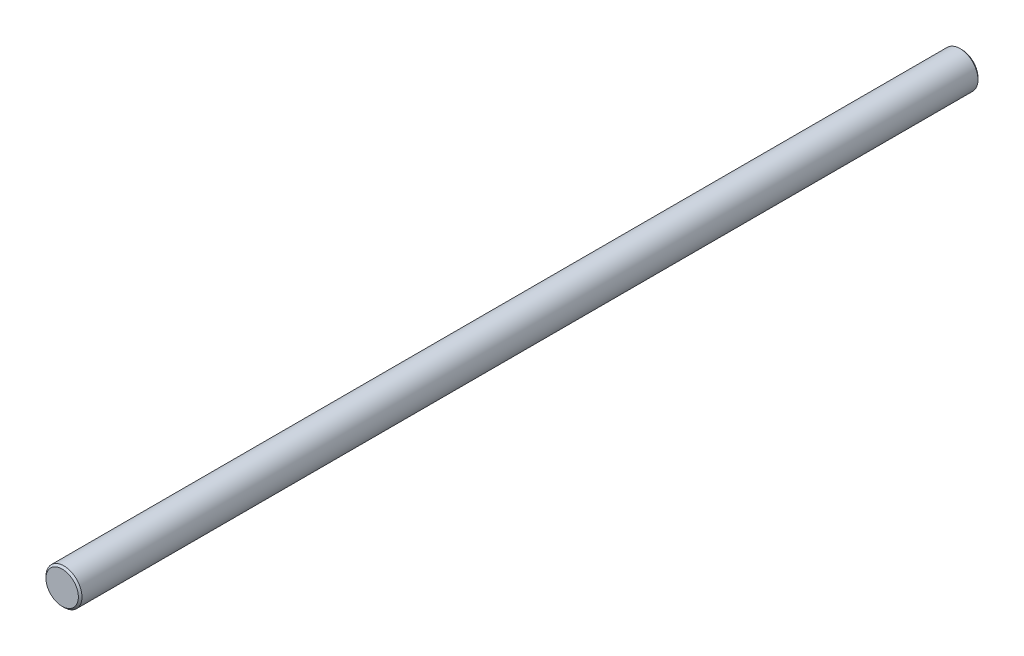
ISO-10303-21;
HEADER;
FILE_DESCRIPTION(('STEP AP214'),'2;1');
FILE_NAME('part.step','',(''),(''),'','','');
FILE_SCHEMA(('AUTOMOTIVE_DESIGN { 1 0 10303 214 1 1 1 1 }'));
ENDSEC;
DATA;
#1=APPLICATION_CONTEXT('core data for automotive mechanical design processes');
#2=APPLICATION_PROTOCOL_DEFINITION('international standard','automotive_design',2000,#1);
#3=PRODUCT_CONTEXT('',#1,'mechanical');
#4=PRODUCT('Part','Part','',(#3));
#5=PRODUCT_RELATED_PRODUCT_CATEGORY('part','',(#4));
#6=PRODUCT_DEFINITION_FORMATION('','',#4);
#7=PRODUCT_DEFINITION_CONTEXT('part definition',#1,'design');
#8=PRODUCT_DEFINITION('design','',#6,#7);
#9=PRODUCT_DEFINITION_SHAPE('','',#8);
#10=(LENGTH_UNIT() NAMED_UNIT(*) SI_UNIT(.MILLI.,.METRE.));
#11=(NAMED_UNIT(*) PLANE_ANGLE_UNIT() SI_UNIT($,.RADIAN.));
#12=(NAMED_UNIT(*) SI_UNIT($,.STERADIAN.) SOLID_ANGLE_UNIT());
#13=UNCERTAINTY_MEASURE_WITH_UNIT(LENGTH_MEASURE(1.E-05),#10,'distance_accuracy_value','');
#14=(GEOMETRIC_REPRESENTATION_CONTEXT(3) GLOBAL_UNCERTAINTY_ASSIGNED_CONTEXT((#13)) GLOBAL_UNIT_ASSIGNED_CONTEXT((#10,
#11,#12)) REPRESENTATION_CONTEXT('',''));
#15=CARTESIAN_POINT('',(0.,0.,0.));
#16=DIRECTION('',(0.,0.,1.));
#17=DIRECTION('',(1.,0.,0.));
#18=AXIS2_PLACEMENT_3D('',#15,#16,#17);
#19=CARTESIAN_POINT('',(0.,0.,500.));
#20=DIRECTION('',(0.,0.,-1.));
#21=DIRECTION('',(-1.,0.,0.));
#22=AXIS2_PLACEMENT_3D('',#19,#20,#21);
#23=CYLINDRICAL_SURFACE('',#22,10.);
#24=CARTESIAN_POINT('',(0.,0.,499.));
#25=DIRECTION('',(0.,0.,1.));
#26=DIRECTION('',(1.,0.,0.));
#27=AXIS2_PLACEMENT_3D('',#24,#25,#26);
#28=CIRCLE('',#27,10.);
#29=CARTESIAN_POINT('',(10.,0.,499.));
#30=VERTEX_POINT('',#29);
#31=EDGE_CURVE('E38',#30,#30,#28,.F.);
#32=ORIENTED_EDGE('',*,*,#31,.T.);
#33=EDGE_LOOP('',(#32));
#34=FACE_BOUND('',#33,.T.);
#35=CARTESIAN_POINT('',(0.,0.,1.));
#36=DIRECTION('',(0.,0.,1.));
#37=DIRECTION('',(1.,0.,0.));
#38=AXIS2_PLACEMENT_3D('',#35,#36,#37);
#39=CIRCLE('',#38,10.);
#40=CARTESIAN_POINT('',(10.,0.,1.));
#41=VERTEX_POINT('',#40);
#42=EDGE_CURVE('E42',#41,#41,#39,.T.);
#43=ORIENTED_EDGE('',*,*,#42,.T.);
#44=EDGE_LOOP('',(#43));
#45=FACE_BOUND('',#44,.T.);
#46=ADVANCED_FACE('F31',(#34,#45),#23,.T.);
#47=CARTESIAN_POINT('',(0.,0.,500.));
#48=DIRECTION('',(0.,0.,1.));
#49=DIRECTION('',(1.,0.,0.));
#50=AXIS2_PLACEMENT_3D('',#47,#48,#49);
#51=PLANE('',#50);
#52=CARTESIAN_POINT('',(0.,0.,500.));
#53=DIRECTION('',(0.,0.,1.));
#54=DIRECTION('',(1.,0.,0.));
#55=AXIS2_PLACEMENT_3D('',#52,#53,#54);
#56=CIRCLE('',#55,8.9999999999999);
#57=CARTESIAN_POINT('',(8.9999999999999,0.,500.));
#58=VERTEX_POINT('',#57);
#59=EDGE_CURVE('E46',#58,#58,#56,.T.);
#60=ORIENTED_EDGE('',*,*,#59,.T.);
#61=EDGE_LOOP('',(#60));
#62=FACE_BOUND('',#61,.T.);
#63=ADVANCED_FACE('F52',(#62),#51,.T.);
#64=CARTESIAN_POINT('',(0.,0.,0.));
#65=DIRECTION('',(0.,0.,1.));
#66=DIRECTION('',(1.,0.,0.));
#67=AXIS2_PLACEMENT_3D('',#64,#65,#66);
#68=PLANE('',#67);
#69=CARTESIAN_POINT('',(0.,0.,0.));
#70=DIRECTION('',(0.,0.,1.));
#71=DIRECTION('',(1.,0.,0.));
#72=AXIS2_PLACEMENT_3D('',#69,#70,#71);
#73=CIRCLE('',#72,9.00000000000001);
#74=CARTESIAN_POINT('',(9.00000000000001,0.,0.));
#75=VERTEX_POINT('',#74);
#76=EDGE_CURVE('E10',#75,#75,#73,.F.);
#77=ORIENTED_EDGE('',*,*,#76,.T.);
#78=EDGE_LOOP('',(#77));
#79=FACE_BOUND('',#78,.T.);
#80=ADVANCED_FACE('F56',(#79),#68,.F.);
#81=CARTESIAN_POINT('',(0.,0.,500.));
#82=DIRECTION('',(0.,0.,-1.));
#83=DIRECTION('',(-1.,0.,0.));
#84=AXIS2_PLACEMENT_3D('',#81,#82,#83);
#85=CONICAL_SURFACE('',#84,8.9999999999999,0.785398163397444);
#86=ORIENTED_EDGE('',*,*,#31,.F.);
#87=EDGE_LOOP('',(#86));
#88=FACE_BOUND('',#87,.T.);
#89=ORIENTED_EDGE('',*,*,#59,.F.);
#90=EDGE_LOOP('',(#89));
#91=FACE_BOUND('',#90,.T.);
#92=ADVANCED_FACE('F54',(#88,#91),#85,.T.);
#93=CARTESIAN_POINT('',(0.,0.,1.));
#94=DIRECTION('',(0.,0.,1.));
#95=DIRECTION('',(1.,0.,0.));
#96=AXIS2_PLACEMENT_3D('',#93,#94,#95);
#97=CONICAL_SURFACE('',#96,10.,0.785398163397444);
#98=ORIENTED_EDGE('',*,*,#76,.F.);
#99=EDGE_LOOP('',(#98));
#100=FACE_BOUND('',#99,.T.);
#101=ORIENTED_EDGE('',*,*,#42,.F.);
#102=EDGE_LOOP('',(#101));
#103=FACE_BOUND('',#102,.T.);
#104=ADVANCED_FACE('F33',(#100,#103),#97,.T.);
#105=CLOSED_SHELL('',(#46,#63,#80,#92,#104));
#106=MANIFOLD_SOLID_BREP('B2',#105);
#107=ADVANCED_BREP_SHAPE_REPRESENTATION('',(#18,#106),#14);
#108=SHAPE_DEFINITION_REPRESENTATION(#9,#107);
ENDSEC;
END-ISO-10303-21;
